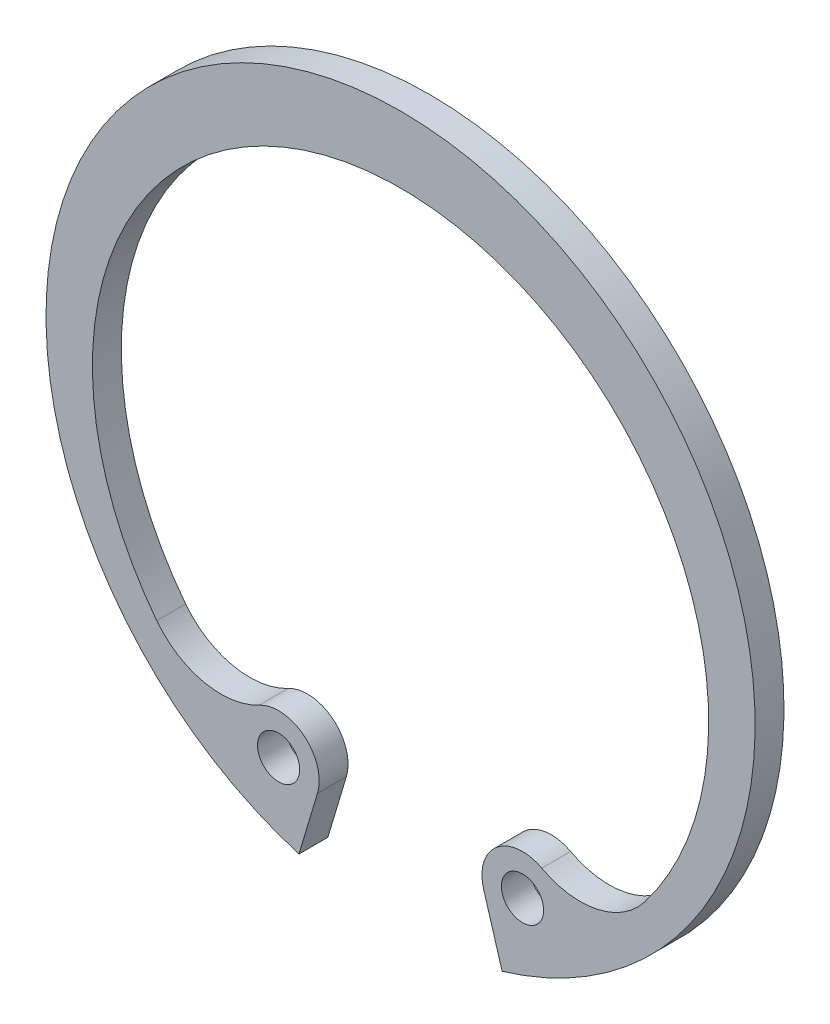
ISO-10303-21;
HEADER;
FILE_DESCRIPTION(('STEP AP214'),'2;1');
FILE_NAME('part.step','',(''),(''),'','','');
FILE_SCHEMA(('AUTOMOTIVE_DESIGN { 1 0 10303 214 1 1 1 1 }'));
ENDSEC;
DATA;
#1=APPLICATION_CONTEXT('core data for automotive mechanical design processes');
#2=APPLICATION_PROTOCOL_DEFINITION('international standard','automotive_design',2000,#1);
#3=PRODUCT_CONTEXT('',#1,'mechanical');
#4=PRODUCT('Part','Part','',(#3));
#5=PRODUCT_RELATED_PRODUCT_CATEGORY('part','',(#4));
#6=PRODUCT_DEFINITION_FORMATION('','',#4);
#7=PRODUCT_DEFINITION_CONTEXT('part definition',#1,'design');
#8=PRODUCT_DEFINITION('design','',#6,#7);
#9=PRODUCT_DEFINITION_SHAPE('','',#8);
#10=(LENGTH_UNIT() NAMED_UNIT(*) SI_UNIT(.MILLI.,.METRE.));
#11=(NAMED_UNIT(*) PLANE_ANGLE_UNIT() SI_UNIT($,.RADIAN.));
#12=(NAMED_UNIT(*) SI_UNIT($,.STERADIAN.) SOLID_ANGLE_UNIT());
#13=UNCERTAINTY_MEASURE_WITH_UNIT(LENGTH_MEASURE(1.E-05),#10,'distance_accuracy_value','');
#14=(GEOMETRIC_REPRESENTATION_CONTEXT(3) GLOBAL_UNCERTAINTY_ASSIGNED_CONTEXT((#13)) GLOBAL_UNIT_ASSIGNED_CONTEXT((#10,
#11,#12)) REPRESENTATION_CONTEXT('',''));
#15=CARTESIAN_POINT('',(0.,0.,0.));
#16=DIRECTION('',(0.,0.,1.));
#17=DIRECTION('',(1.,0.,0.));
#18=AXIS2_PLACEMENT_3D('',#15,#16,#17);
#19=CARTESIAN_POINT('',(0.,0.,-1.3));
#20=DIRECTION('',(0.,0.,1.));
#21=DIRECTION('',(1.,0.,0.));
#22=AXIS2_PLACEMENT_3D('',#19,#20,#21);
#23=CYLINDRICAL_SURFACE('',#22,15.95);
#24=CARTESIAN_POINT('',(0.,0.,0.));
#25=DIRECTION('',(0.,0.,1.));
#26=DIRECTION('',(1.,0.,0.));
#27=AXIS2_PLACEMENT_3D('',#24,#25,#26);
#28=CIRCLE('',#27,15.95);
#29=CARTESIAN_POINT('',(4.56893790049978,-15.2816002585258,0.));
#30=VERTEX_POINT('',#29);
#31=CARTESIAN_POINT('',(-4.56893790049978,-15.2816002585258,0.));
#32=VERTEX_POINT('',#31);
#33=EDGE_CURVE('E138',#30,#32,#28,.T.);
#34=ORIENTED_EDGE('',*,*,#33,.F.);
#35=DIRECTION('',(0.,0.,1.));
#36=VECTOR('',#35,1.);
#37=CARTESIAN_POINT('',(4.56893790049978,-15.2816002585258,-1.3));
#38=LINE('',#37,#36);
#39=CARTESIAN_POINT('',(4.56893790049978,-15.2816002585258,-1.3));
#40=VERTEX_POINT('',#39);
#41=EDGE_CURVE('E11',#40,#30,#38,.T.);
#42=ORIENTED_EDGE('',*,*,#41,.F.);
#43=CARTESIAN_POINT('',(0.,0.,-1.3));
#44=DIRECTION('',(0.,0.,1.));
#45=DIRECTION('',(1.,0.,0.));
#46=AXIS2_PLACEMENT_3D('',#43,#44,#45);
#47=CIRCLE('',#46,15.95);
#48=CARTESIAN_POINT('',(-4.56893790049978,-15.2816002585258,-1.3));
#49=VERTEX_POINT('',#48);
#50=EDGE_CURVE('E159',#40,#49,#47,.T.);
#51=ORIENTED_EDGE('',*,*,#50,.T.);
#52=DIRECTION('',(0.,0.,1.));
#53=VECTOR('',#52,1.);
#54=CARTESIAN_POINT('',(-4.56893790049978,-15.2816002585258,-1.3));
#55=LINE('',#54,#53);
#56=EDGE_CURVE('E44',#49,#32,#55,.T.);
#57=ORIENTED_EDGE('',*,*,#56,.T.);
#58=EDGE_LOOP('',(#34,#42,#51,#57));
#59=FACE_BOUND('',#58,.T.);
#60=ADVANCED_FACE('F41',(#59),#23,.T.);
#61=CARTESIAN_POINT('',(4.56893790049978,-15.2816002585258,-1.3));
#62=DIRECTION('',(-0.958094060095663,-0.28645378686519,0.));
#63=DIRECTION('',(0.28645378686519,-0.958094060095663,0.));
#64=AXIS2_PLACEMENT_3D('',#61,#62,#63);
#65=PLANE('',#64);
#66=DIRECTION('',(0.28645378686519,-0.958094060095663,0.));
#67=VECTOR('',#66,1.);
#68=CARTESIAN_POINT('',(4.56893790049978,-15.2816002585258,0.));
#69=LINE('',#68,#67);
#70=CARTESIAN_POINT('',(3.73764567403087,-12.501200135003,0.));
#71=VERTEX_POINT('',#70);
#72=EDGE_CURVE('E157',#71,#30,#69,.T.);
#73=ORIENTED_EDGE('',*,*,#72,.F.);
#74=DIRECTION('',(0.,0.,1.));
#75=VECTOR('',#74,1.);
#76=CARTESIAN_POINT('',(3.73764567403087,-12.501200135003,-1.3));
#77=LINE('',#76,#75);
#78=CARTESIAN_POINT('',(3.73764567403087,-12.501200135003,-1.3));
#79=VERTEX_POINT('',#78);
#80=EDGE_CURVE('E50',#79,#71,#77,.T.);
#81=ORIENTED_EDGE('',*,*,#80,.F.);
#82=DIRECTION('',(0.28645378686519,-0.958094060095663,0.));
#83=VECTOR('',#82,1.);
#84=CARTESIAN_POINT('',(4.56893790049978,-15.2816002585258,-1.3));
#85=LINE('',#84,#83);
#86=EDGE_CURVE('E128',#79,#40,#85,.T.);
#87=ORIENTED_EDGE('',*,*,#86,.T.);
#88=ORIENTED_EDGE('',*,*,#41,.T.);
#89=EDGE_LOOP('',(#73,#81,#87,#88));
#90=FACE_BOUND('',#89,.T.);
#91=ADVANCED_FACE('F171',(#90),#65,.T.);
#92=CARTESIAN_POINT('',(5.48616733370546,-11.978421973974,-1.3));
#93=DIRECTION('',(0.,0.,1.));
#94=DIRECTION('',(1.,0.,0.));
#95=AXIS2_PLACEMENT_3D('',#92,#93,#94);
#96=CYLINDRICAL_SURFACE('',#95,1.825);
#97=CARTESIAN_POINT('',(5.48616733370546,-11.978421973974,0.));
#98=DIRECTION('',(0.,0.,1.));
#99=DIRECTION('',(1.,0.,0.));
#100=AXIS2_PLACEMENT_3D('',#97,#98,#99);
#101=CIRCLE('',#100,1.825);
#102=CARTESIAN_POINT('',(6.35082211323619,-10.3712514440567,0.));
#103=VERTEX_POINT('',#102);
#104=EDGE_CURVE('E115',#103,#71,#101,.T.);
#105=ORIENTED_EDGE('',*,*,#104,.F.);
#106=DIRECTION('',(0.,0.,1.));
#107=VECTOR('',#106,1.);
#108=CARTESIAN_POINT('',(6.35082211323619,-10.3712514440567,-1.3));
#109=LINE('',#108,#107);
#110=CARTESIAN_POINT('',(6.35082211323619,-10.3712514440567,-1.3));
#111=VERTEX_POINT('',#110);
#112=EDGE_CURVE('E110',#111,#103,#109,.T.);
#113=ORIENTED_EDGE('',*,*,#112,.F.);
#114=CARTESIAN_POINT('',(5.48616733370546,-11.978421973974,-1.3));
#115=DIRECTION('',(0.,0.,1.));
#116=DIRECTION('',(1.,0.,0.));
#117=AXIS2_PLACEMENT_3D('',#114,#115,#116);
#118=CIRCLE('',#117,1.825);
#119=EDGE_CURVE('E113',#111,#79,#118,.T.);
#120=ORIENTED_EDGE('',*,*,#119,.T.);
#121=ORIENTED_EDGE('',*,*,#80,.T.);
#122=EDGE_LOOP('',(#105,#113,#120,#121));
#123=FACE_BOUND('',#122,.T.);
#124=ADVANCED_FACE('F112',(#123),#96,.T.);
#125=CARTESIAN_POINT('',(8.08013167229767,-7.1569103842221,-1.3));
#126=DIRECTION('',(0.,0.,1.));
#127=DIRECTION('',(1.,0.,0.));
#128=AXIS2_PLACEMENT_3D('',#125,#126,#127);
#129=CYLINDRICAL_SURFACE('',#128,3.65);
#130=CARTESIAN_POINT('',(8.08013167229767,-7.1569103842221,0.));
#131=DIRECTION('',(0.,0.,-1.));
#132=DIRECTION('',(1.,0.,0.));
#133=AXIS2_PLACEMENT_3D('',#130,#131,#132);
#134=CIRCLE('',#133,3.65);
#135=CARTESIAN_POINT('',(10.9681322755244,-9.38893917340969,0.));
#136=VERTEX_POINT('',#135);
#137=EDGE_CURVE('E154',#136,#103,#134,.T.);
#138=ORIENTED_EDGE('',*,*,#137,.F.);
#139=DIRECTION('',(0.,0.,1.));
#140=VECTOR('',#139,1.);
#141=CARTESIAN_POINT('',(10.9681322755244,-9.38893917340969,-1.3));
#142=LINE('',#141,#140);
#143=CARTESIAN_POINT('',(10.9681322755244,-9.38893917340969,-1.3));
#144=VERTEX_POINT('',#143);
#145=EDGE_CURVE('E120',#144,#136,#142,.T.);
#146=ORIENTED_EDGE('',*,*,#145,.F.);
#147=CARTESIAN_POINT('',(8.08013167229767,-7.1569103842221,-1.3));
#148=DIRECTION('',(0.,0.,-1.));
#149=DIRECTION('',(1.,0.,0.));
#150=AXIS2_PLACEMENT_3D('',#147,#148,#149);
#151=CIRCLE('',#150,3.65);
#152=EDGE_CURVE('E126',#144,#111,#151,.T.);
#153=ORIENTED_EDGE('',*,*,#152,.T.);
#154=ORIENTED_EDGE('',*,*,#112,.T.);
#155=EDGE_LOOP('',(#138,#146,#153,#154));
#156=FACE_BOUND('',#155,.T.);
#157=ADVANCED_FACE('F130',(#156),#129,.F.);
#158=CARTESIAN_POINT('',(0.,-0.912075638396721,-1.3));
#159=DIRECTION('',(0.,0.,1.));
#160=DIRECTION('',(1.,0.,0.));
#161=AXIS2_PLACEMENT_3D('',#158,#159,#160);
#162=CYLINDRICAL_SURFACE('',#161,13.8620756383967);
#163=CARTESIAN_POINT('',(0.,-0.912075638396721,0.));
#164=DIRECTION('',(0.,0.,-1.));
#165=DIRECTION('',(1.,0.,0.));
#166=AXIS2_PLACEMENT_3D('',#163,#164,#165);
#167=CIRCLE('',#166,13.8620756383967);
#168=CARTESIAN_POINT('',(-10.9681322755244,-9.38893917340969,0.));
#169=VERTEX_POINT('',#168);
#170=EDGE_CURVE('E151',#169,#136,#167,.T.);
#171=ORIENTED_EDGE('',*,*,#170,.F.);
#172=DIRECTION('',(0.,0.,1.));
#173=VECTOR('',#172,1.);
#174=CARTESIAN_POINT('',(-10.9681322755244,-9.38893917340969,-1.3));
#175=LINE('',#174,#173);
#176=CARTESIAN_POINT('',(-10.9681322755244,-9.38893917340969,-1.3));
#177=VERTEX_POINT('',#176);
#178=EDGE_CURVE('E163',#177,#169,#175,.T.);
#179=ORIENTED_EDGE('',*,*,#178,.F.);
#180=CARTESIAN_POINT('',(0.,-0.912075638396721,-1.3));
#181=DIRECTION('',(0.,0.,-1.));
#182=DIRECTION('',(1.,0.,0.));
#183=AXIS2_PLACEMENT_3D('',#180,#181,#182);
#184=CIRCLE('',#183,13.8620756383967);
#185=EDGE_CURVE('E131',#177,#144,#184,.T.);
#186=ORIENTED_EDGE('',*,*,#185,.T.);
#187=ORIENTED_EDGE('',*,*,#145,.T.);
#188=EDGE_LOOP('',(#171,#179,#186,#187));
#189=FACE_BOUND('',#188,.T.);
#190=ADVANCED_FACE('F184',(#189),#162,.F.);
#191=CARTESIAN_POINT('',(-8.08013167229766,-7.1569103842221,-1.3));
#192=DIRECTION('',(0.,0.,1.));
#193=DIRECTION('',(1.,0.,0.));
#194=AXIS2_PLACEMENT_3D('',#191,#192,#193);
#195=CYLINDRICAL_SURFACE('',#194,3.65);
#196=CARTESIAN_POINT('',(-8.08013167229766,-7.1569103842221,0.));
#197=DIRECTION('',(0.,0.,-1.));
#198=DIRECTION('',(1.,0.,0.));
#199=AXIS2_PLACEMENT_3D('',#196,#197,#198);
#200=CIRCLE('',#199,3.65);
#201=CARTESIAN_POINT('',(-6.35082211323619,-10.3712514440567,0.));
#202=VERTEX_POINT('',#201);
#203=EDGE_CURVE('E148',#202,#169,#200,.T.);
#204=ORIENTED_EDGE('',*,*,#203,.F.);
#205=DIRECTION('',(0.,0.,1.));
#206=VECTOR('',#205,1.);
#207=CARTESIAN_POINT('',(-6.35082211323619,-10.3712514440567,-1.3));
#208=LINE('',#207,#206);
#209=CARTESIAN_POINT('',(-6.35082211323619,-10.3712514440567,-1.3));
#210=VERTEX_POINT('',#209);
#211=EDGE_CURVE('E165',#210,#202,#208,.T.);
#212=ORIENTED_EDGE('',*,*,#211,.F.);
#213=CARTESIAN_POINT('',(-8.08013167229766,-7.1569103842221,-1.3));
#214=DIRECTION('',(0.,0.,-1.));
#215=DIRECTION('',(1.,0.,0.));
#216=AXIS2_PLACEMENT_3D('',#213,#214,#215);
#217=CIRCLE('',#216,3.65);
#218=EDGE_CURVE('E133',#210,#177,#217,.T.);
#219=ORIENTED_EDGE('',*,*,#218,.T.);
#220=ORIENTED_EDGE('',*,*,#178,.T.);
#221=EDGE_LOOP('',(#204,#212,#219,#220));
#222=FACE_BOUND('',#221,.T.);
#223=ADVANCED_FACE('F187',(#222),#195,.F.);
#224=CARTESIAN_POINT('',(-5.48616733370546,-11.978421973974,-1.3));
#225=DIRECTION('',(0.,0.,1.));
#226=DIRECTION('',(1.,0.,0.));
#227=AXIS2_PLACEMENT_3D('',#224,#225,#226);
#228=CYLINDRICAL_SURFACE('',#227,1.825);
#229=CARTESIAN_POINT('',(-5.48616733370546,-11.978421973974,0.));
#230=DIRECTION('',(0.,0.,1.));
#231=DIRECTION('',(1.,0.,0.));
#232=AXIS2_PLACEMENT_3D('',#229,#230,#231);
#233=CIRCLE('',#232,1.825);
#234=CARTESIAN_POINT('',(-3.73764567403087,-12.501200135003,0.));
#235=VERTEX_POINT('',#234);
#236=EDGE_CURVE('E145',#235,#202,#233,.T.);
#237=ORIENTED_EDGE('',*,*,#236,.F.);
#238=DIRECTION('',(0.,0.,1.));
#239=VECTOR('',#238,1.);
#240=CARTESIAN_POINT('',(-3.73764567403087,-12.501200135003,-1.3));
#241=LINE('',#240,#239);
#242=CARTESIAN_POINT('',(-3.73764567403087,-12.501200135003,-1.3));
#243=VERTEX_POINT('',#242);
#244=EDGE_CURVE('E166',#243,#235,#241,.T.);
#245=ORIENTED_EDGE('',*,*,#244,.F.);
#246=CARTESIAN_POINT('',(-5.48616733370546,-11.978421973974,-1.3));
#247=DIRECTION('',(0.,0.,1.));
#248=DIRECTION('',(1.,0.,0.));
#249=AXIS2_PLACEMENT_3D('',#246,#247,#248);
#250=CIRCLE('',#249,1.825);
#251=EDGE_CURVE('E233',#243,#210,#250,.T.);
#252=ORIENTED_EDGE('',*,*,#251,.T.);
#253=ORIENTED_EDGE('',*,*,#211,.T.);
#254=EDGE_LOOP('',(#237,#245,#252,#253));
#255=FACE_BOUND('',#254,.T.);
#256=ADVANCED_FACE('F191',(#255),#228,.T.);
#257=CARTESIAN_POINT('',(-4.56893790049978,-15.2816002585258,-1.3));
#258=DIRECTION('',(0.958094060095663,-0.28645378686519,0.));
#259=DIRECTION('',(0.28645378686519,0.958094060095663,0.));
#260=AXIS2_PLACEMENT_3D('',#257,#258,#259);
#261=PLANE('',#260);
#262=DIRECTION('',(0.28645378686519,0.958094060095663,0.));
#263=VECTOR('',#262,1.);
#264=CARTESIAN_POINT('',(-4.56893790049978,-15.2816002585258,0.));
#265=LINE('',#264,#263);
#266=EDGE_CURVE('E141',#32,#235,#265,.T.);
#267=ORIENTED_EDGE('',*,*,#266,.F.);
#268=ORIENTED_EDGE('',*,*,#56,.F.);
#269=DIRECTION('',(0.28645378686519,0.958094060095663,0.));
#270=VECTOR('',#269,1.);
#271=CARTESIAN_POINT('',(-4.56893790049978,-15.2816002585258,-1.3));
#272=LINE('',#271,#270);
#273=EDGE_CURVE('E231',#49,#243,#272,.T.);
#274=ORIENTED_EDGE('',*,*,#273,.T.);
#275=ORIENTED_EDGE('',*,*,#244,.T.);
#276=EDGE_LOOP('',(#267,#268,#274,#275));
#277=FACE_BOUND('',#276,.T.);
#278=ADVANCED_FACE('F168',(#277),#261,.T.);
#279=CARTESIAN_POINT('',(0.,0.,-1.3));
#280=DIRECTION('',(0.,0.,1.));
#281=DIRECTION('',(1.,0.,0.));
#282=AXIS2_PLACEMENT_3D('',#279,#280,#281);
#283=PLANE('',#282);
#284=CARTESIAN_POINT('',(-5.48616733370546,-11.978421973974,-1.3));
#285=DIRECTION('',(0.,0.,1.));
#286=DIRECTION('',(1.,0.,0.));
#287=AXIS2_PLACEMENT_3D('',#284,#285,#286);
#288=CIRCLE('',#287,0.95);
#289=CARTESIAN_POINT('',(-4.53616733370546,-11.978421973974,-1.3));
#290=VERTEX_POINT('',#289);
#291=EDGE_CURVE('E218',#290,#290,#288,.T.);
#292=ORIENTED_EDGE('',*,*,#291,.T.);
#293=EDGE_LOOP('',(#292));
#294=FACE_BOUND('',#293,.T.);
#295=CARTESIAN_POINT('',(5.48616733370546,-11.978421973974,-1.3));
#296=DIRECTION('',(0.,0.,1.));
#297=DIRECTION('',(1.,0.,0.));
#298=AXIS2_PLACEMENT_3D('',#295,#296,#297);
#299=CIRCLE('',#298,0.95);
#300=CARTESIAN_POINT('',(6.43616733370546,-11.978421973974,-1.3));
#301=VERTEX_POINT('',#300);
#302=EDGE_CURVE('E142',#301,#301,#299,.T.);
#303=ORIENTED_EDGE('',*,*,#302,.T.);
#304=EDGE_LOOP('',(#303));
#305=FACE_BOUND('',#304,.T.);
#306=ORIENTED_EDGE('',*,*,#50,.F.);
#307=ORIENTED_EDGE('',*,*,#86,.F.);
#308=ORIENTED_EDGE('',*,*,#119,.F.);
#309=ORIENTED_EDGE('',*,*,#152,.F.);
#310=ORIENTED_EDGE('',*,*,#185,.F.);
#311=ORIENTED_EDGE('',*,*,#218,.F.);
#312=ORIENTED_EDGE('',*,*,#251,.F.);
#313=ORIENTED_EDGE('',*,*,#273,.F.);
#314=EDGE_LOOP('',(#306,#307,#308,#309,#310,#311,#312,#313));
#315=FACE_BOUND('',#314,.T.);
#316=ADVANCED_FACE('F124',(#294,#305,#315),#283,.F.);
#317=CARTESIAN_POINT('',(0.,0.,0.));
#318=DIRECTION('',(0.,0.,1.));
#319=DIRECTION('',(1.,0.,0.));
#320=AXIS2_PLACEMENT_3D('',#317,#318,#319);
#321=PLANE('',#320);
#322=CARTESIAN_POINT('',(-5.48616733370546,-11.978421973974,0.));
#323=DIRECTION('',(0.,0.,1.));
#324=DIRECTION('',(1.,0.,0.));
#325=AXIS2_PLACEMENT_3D('',#322,#323,#324);
#326=CIRCLE('',#325,0.95);
#327=CARTESIAN_POINT('',(-4.53616733370546,-11.978421973974,0.));
#328=VERTEX_POINT('',#327);
#329=EDGE_CURVE('E221',#328,#328,#326,.T.);
#330=ORIENTED_EDGE('',*,*,#329,.F.);
#331=EDGE_LOOP('',(#330));
#332=FACE_BOUND('',#331,.T.);
#333=CARTESIAN_POINT('',(5.48616733370546,-11.978421973974,0.));
#334=DIRECTION('',(0.,0.,1.));
#335=DIRECTION('',(1.,0.,0.));
#336=AXIS2_PLACEMENT_3D('',#333,#334,#335);
#337=CIRCLE('',#336,0.95);
#338=CARTESIAN_POINT('',(6.43616733370546,-11.978421973974,0.));
#339=VERTEX_POINT('',#338);
#340=EDGE_CURVE('E223',#339,#339,#337,.T.);
#341=ORIENTED_EDGE('',*,*,#340,.F.);
#342=EDGE_LOOP('',(#341));
#343=FACE_BOUND('',#342,.T.);
#344=ORIENTED_EDGE('',*,*,#33,.T.);
#345=ORIENTED_EDGE('',*,*,#266,.T.);
#346=ORIENTED_EDGE('',*,*,#236,.T.);
#347=ORIENTED_EDGE('',*,*,#203,.T.);
#348=ORIENTED_EDGE('',*,*,#170,.T.);
#349=ORIENTED_EDGE('',*,*,#137,.T.);
#350=ORIENTED_EDGE('',*,*,#104,.T.);
#351=ORIENTED_EDGE('',*,*,#72,.T.);
#352=EDGE_LOOP('',(#344,#345,#346,#347,#348,#349,#350,#351));
#353=FACE_BOUND('',#352,.T.);
#354=ADVANCED_FACE('F170',(#332,#343,#353),#321,.T.);
#355=CARTESIAN_POINT('',(5.48616733370546,-11.978421973974,-1.3));
#356=DIRECTION('',(0.,0.,1.));
#357=DIRECTION('',(1.,0.,0.));
#358=AXIS2_PLACEMENT_3D('',#355,#356,#357);
#359=CYLINDRICAL_SURFACE('',#358,0.95);
#360=ORIENTED_EDGE('',*,*,#302,.F.);
#361=EDGE_LOOP('',(#360));
#362=FACE_BOUND('',#361,.T.);
#363=ORIENTED_EDGE('',*,*,#340,.T.);
#364=EDGE_LOOP('',(#363));
#365=FACE_BOUND('',#364,.T.);
#366=ADVANCED_FACE('F203',(#362,#365),#359,.F.);
#367=CARTESIAN_POINT('',(-5.48616733370546,-11.978421973974,-1.3));
#368=DIRECTION('',(0.,0.,1.));
#369=DIRECTION('',(1.,0.,0.));
#370=AXIS2_PLACEMENT_3D('',#367,#368,#369);
#371=CYLINDRICAL_SURFACE('',#370,0.95);
#372=ORIENTED_EDGE('',*,*,#291,.F.);
#373=EDGE_LOOP('',(#372));
#374=FACE_BOUND('',#373,.T.);
#375=ORIENTED_EDGE('',*,*,#329,.T.);
#376=EDGE_LOOP('',(#375));
#377=FACE_BOUND('',#376,.T.);
#378=ADVANCED_FACE('F210',(#374,#377),#371,.F.);
#379=CLOSED_SHELL('',(#60,#91,#124,#157,#190,#223,#256,#278,#316,#354,#366,#378));
#380=MANIFOLD_SOLID_BREP('B2',#379);
#381=ADVANCED_BREP_SHAPE_REPRESENTATION('',(#18,#380),#14);
#382=SHAPE_DEFINITION_REPRESENTATION(#9,#381);
ENDSEC;
END-ISO-10303-21;
